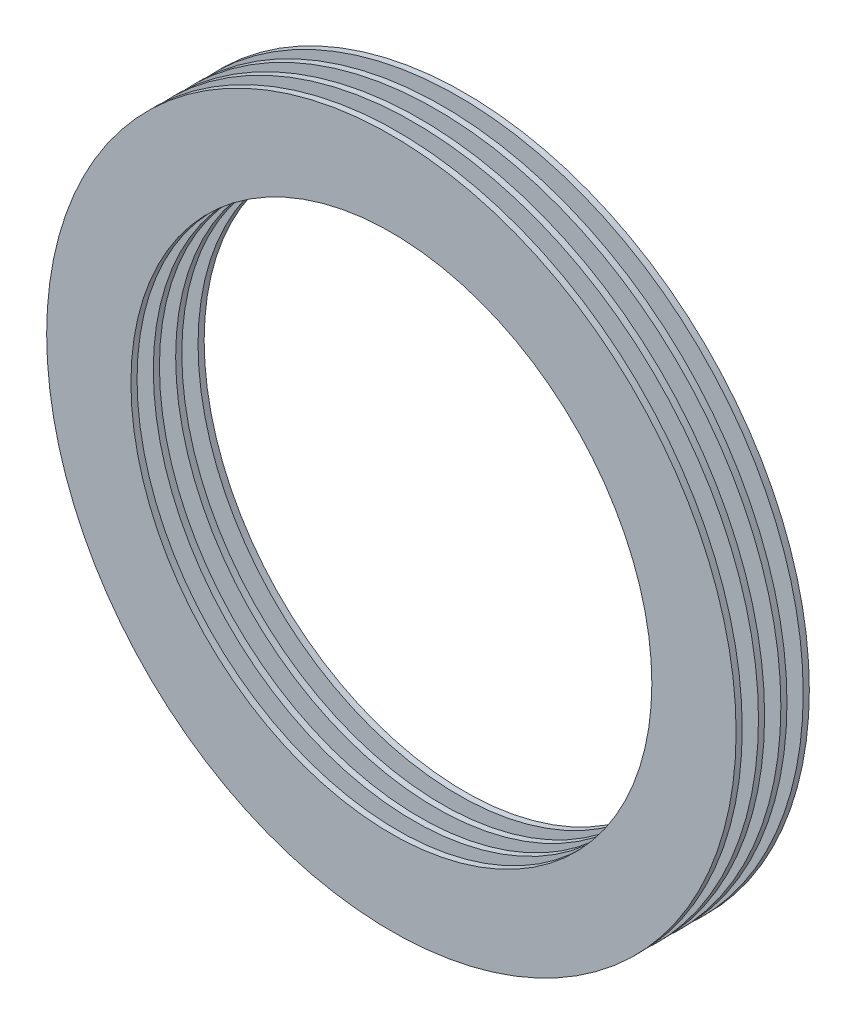
ISO-10303-21;
HEADER;
FILE_DESCRIPTION(('STEP AP214'),'2;1');
FILE_NAME('part.step','',(''),(''),'','','');
FILE_SCHEMA(('AUTOMOTIVE_DESIGN { 1 0 10303 214 1 1 1 1 }'));
ENDSEC;
DATA;
#1=APPLICATION_CONTEXT('core data for automotive mechanical design processes');
#2=APPLICATION_PROTOCOL_DEFINITION('international standard','automotive_design',2000,#1);
#3=PRODUCT_CONTEXT('',#1,'mechanical');
#4=PRODUCT('Part','Part','',(#3));
#5=PRODUCT_RELATED_PRODUCT_CATEGORY('part','',(#4));
#6=PRODUCT_DEFINITION_FORMATION('','',#4);
#7=PRODUCT_DEFINITION_CONTEXT('part definition',#1,'design');
#8=PRODUCT_DEFINITION('design','',#6,#7);
#9=PRODUCT_DEFINITION_SHAPE('','',#8);
#10=(LENGTH_UNIT() NAMED_UNIT(*) SI_UNIT(.MILLI.,.METRE.));
#11=(NAMED_UNIT(*) PLANE_ANGLE_UNIT() SI_UNIT($,.RADIAN.));
#12=(NAMED_UNIT(*) SI_UNIT($,.STERADIAN.) SOLID_ANGLE_UNIT());
#13=UNCERTAINTY_MEASURE_WITH_UNIT(LENGTH_MEASURE(1.E-05),#10,'distance_accuracy_value','');
#14=(GEOMETRIC_REPRESENTATION_CONTEXT(3) GLOBAL_UNCERTAINTY_ASSIGNED_CONTEXT((#13)) GLOBAL_UNIT_ASSIGNED_CONTEXT((#10,
#11,#12)) REPRESENTATION_CONTEXT('',''));
#15=CARTESIAN_POINT('',(0.,0.,0.));
#16=DIRECTION('',(0.,0.,1.));
#17=DIRECTION('',(1.,0.,0.));
#18=AXIS2_PLACEMENT_3D('',#15,#16,#17);
#19=CARTESIAN_POINT('',(0.,0.,3.0353));
#20=DIRECTION('',(0.,0.,-1.));
#21=DIRECTION('',(-1.,0.,0.));
#22=AXIS2_PLACEMENT_3D('',#19,#20,#21);
#23=CYLINDRICAL_SURFACE('',#22,10.795);
#24=CARTESIAN_POINT('',(0.,0.,3.0353));
#25=DIRECTION('',(0.,0.,1.));
#26=DIRECTION('',(1.,0.,0.));
#27=AXIS2_PLACEMENT_3D('',#24,#25,#26);
#28=CIRCLE('',#27,10.795);
#29=CARTESIAN_POINT('',(10.795,0.,3.0353));
#30=VERTEX_POINT('',#29);
#31=EDGE_CURVE('E56',#30,#30,#28,.T.);
#32=ORIENTED_EDGE('',*,*,#31,.T.);
#33=EDGE_LOOP('',(#32));
#34=FACE_BOUND('',#33,.T.);
#35=CARTESIAN_POINT('',(0.,0.,2.7813));
#36=DIRECTION('',(0.,0.,1.));
#37=DIRECTION('',(1.,0.,0.));
#38=AXIS2_PLACEMENT_3D('',#35,#36,#37);
#39=CIRCLE('',#38,10.795);
#40=CARTESIAN_POINT('',(10.795,0.,2.7813));
#41=VERTEX_POINT('',#40);
#42=EDGE_CURVE('E63',#41,#41,#39,.T.);
#43=ORIENTED_EDGE('',*,*,#42,.F.);
#44=EDGE_LOOP('',(#43));
#45=FACE_BOUND('',#44,.T.);
#46=ADVANCED_FACE('F48',(#34,#45),#23,.F.);
#47=CARTESIAN_POINT('',(0.,0.,3.0353));
#48=DIRECTION('',(0.,0.,-1.));
#49=DIRECTION('',(-1.,0.,0.));
#50=AXIS2_PLACEMENT_3D('',#47,#48,#49);
#51=CYLINDRICAL_SURFACE('',#50,14.2875);
#52=CARTESIAN_POINT('',(0.,0.,3.0353));
#53=DIRECTION('',(0.,0.,1.));
#54=DIRECTION('',(1.,0.,0.));
#55=AXIS2_PLACEMENT_3D('',#52,#53,#54);
#56=CIRCLE('',#55,14.2875);
#57=CARTESIAN_POINT('',(14.2875,0.,3.0353));
#58=VERTEX_POINT('',#57);
#59=EDGE_CURVE('E11',#58,#58,#56,.T.);
#60=ORIENTED_EDGE('',*,*,#59,.F.);
#61=EDGE_LOOP('',(#60));
#62=FACE_BOUND('',#61,.T.);
#63=CARTESIAN_POINT('',(0.,0.,2.7813));
#64=DIRECTION('',(0.,0.,1.));
#65=DIRECTION('',(1.,0.,0.));
#66=AXIS2_PLACEMENT_3D('',#63,#64,#65);
#67=CIRCLE('',#66,14.2875);
#68=CARTESIAN_POINT('',(14.2875,0.,2.7813));
#69=VERTEX_POINT('',#68);
#70=EDGE_CURVE('E51',#69,#69,#67,.T.);
#71=ORIENTED_EDGE('',*,*,#70,.T.);
#72=EDGE_LOOP('',(#71));
#73=FACE_BOUND('',#72,.T.);
#74=ADVANCED_FACE('F70',(#62,#73),#51,.T.);
#75=CARTESIAN_POINT('',(0.,0.,3.0353));
#76=DIRECTION('',(0.,0.,1.));
#77=DIRECTION('',(1.,0.,0.));
#78=AXIS2_PLACEMENT_3D('',#75,#76,#77);
#79=PLANE('',#78);
#80=ORIENTED_EDGE('',*,*,#31,.F.);
#81=EDGE_LOOP('',(#80));
#82=FACE_BOUND('',#81,.T.);
#83=ORIENTED_EDGE('',*,*,#59,.T.);
#84=EDGE_LOOP('',(#83));
#85=FACE_BOUND('',#84,.T.);
#86=ADVANCED_FACE('F74',(#82,#85),#79,.T.);
#87=CARTESIAN_POINT('',(0.,0.,2.7813));
#88=DIRECTION('',(0.,0.,1.));
#89=DIRECTION('',(1.,0.,0.));
#90=AXIS2_PLACEMENT_3D('',#87,#88,#89);
#91=PLANE('',#90);
#92=ORIENTED_EDGE('',*,*,#42,.T.);
#93=EDGE_LOOP('',(#92));
#94=FACE_BOUND('',#93,.T.);
#95=ORIENTED_EDGE('',*,*,#70,.F.);
#96=EDGE_LOOP('',(#95));
#97=FACE_BOUND('',#96,.T.);
#98=ADVANCED_FACE('F72',(#94,#97),#91,.F.);
#99=CLOSED_SHELL('',(#46,#74,#86,#98));
#100=MANIFOLD_SOLID_BREP('B2',#99);
#101=CARTESIAN_POINT('',(0.,0.,2.1082));
#102=DIRECTION('',(0.,0.,-1.));
#103=DIRECTION('',(-1.,0.,0.));
#104=AXIS2_PLACEMENT_3D('',#101,#102,#103);
#105=CYLINDRICAL_SURFACE('',#104,10.795);
#106=CARTESIAN_POINT('',(0.,0.,2.1082));
#107=DIRECTION('',(0.,0.,1.));
#108=DIRECTION('',(1.,0.,0.));
#109=AXIS2_PLACEMENT_3D('',#106,#107,#108);
#110=CIRCLE('',#109,10.795);
#111=CARTESIAN_POINT('',(10.795,0.,2.1082));
#112=VERTEX_POINT('',#111);
#113=EDGE_CURVE('E130',#112,#112,#110,.T.);
#114=ORIENTED_EDGE('',*,*,#113,.T.);
#115=EDGE_LOOP('',(#114));
#116=FACE_BOUND('',#115,.T.);
#117=CARTESIAN_POINT('',(0.,0.,1.8542));
#118=DIRECTION('',(0.,0.,1.));
#119=DIRECTION('',(1.,0.,0.));
#120=AXIS2_PLACEMENT_3D('',#117,#118,#119);
#121=CIRCLE('',#120,10.795);
#122=CARTESIAN_POINT('',(10.795,0.,1.8542));
#123=VERTEX_POINT('',#122);
#124=EDGE_CURVE('E137',#123,#123,#121,.T.);
#125=ORIENTED_EDGE('',*,*,#124,.F.);
#126=EDGE_LOOP('',(#125));
#127=FACE_BOUND('',#126,.T.);
#128=ADVANCED_FACE('F122',(#116,#127),#105,.F.);
#129=CARTESIAN_POINT('',(0.,0.,2.1082));
#130=DIRECTION('',(0.,0.,-1.));
#131=DIRECTION('',(-1.,0.,0.));
#132=AXIS2_PLACEMENT_3D('',#129,#130,#131);
#133=CYLINDRICAL_SURFACE('',#132,14.2875);
#134=CARTESIAN_POINT('',(0.,0.,2.1082));
#135=DIRECTION('',(0.,0.,1.));
#136=DIRECTION('',(1.,0.,0.));
#137=AXIS2_PLACEMENT_3D('',#134,#135,#136);
#138=CIRCLE('',#137,14.2875);
#139=CARTESIAN_POINT('',(14.2875,0.,2.1082));
#140=VERTEX_POINT('',#139);
#141=EDGE_CURVE('E47',#140,#140,#138,.T.);
#142=ORIENTED_EDGE('',*,*,#141,.F.);
#143=EDGE_LOOP('',(#142));
#144=FACE_BOUND('',#143,.T.);
#145=CARTESIAN_POINT('',(0.,0.,1.8542));
#146=DIRECTION('',(0.,0.,1.));
#147=DIRECTION('',(1.,0.,0.));
#148=AXIS2_PLACEMENT_3D('',#145,#146,#147);
#149=CIRCLE('',#148,14.2875);
#150=CARTESIAN_POINT('',(14.2875,0.,1.8542));
#151=VERTEX_POINT('',#150);
#152=EDGE_CURVE('E125',#151,#151,#149,.T.);
#153=ORIENTED_EDGE('',*,*,#152,.T.);
#154=EDGE_LOOP('',(#153));
#155=FACE_BOUND('',#154,.T.);
#156=ADVANCED_FACE('F144',(#144,#155),#133,.T.);
#157=CARTESIAN_POINT('',(0.,0.,2.1082));
#158=DIRECTION('',(0.,0.,1.));
#159=DIRECTION('',(1.,0.,0.));
#160=AXIS2_PLACEMENT_3D('',#157,#158,#159);
#161=PLANE('',#160);
#162=ORIENTED_EDGE('',*,*,#113,.F.);
#163=EDGE_LOOP('',(#162));
#164=FACE_BOUND('',#163,.T.);
#165=ORIENTED_EDGE('',*,*,#141,.T.);
#166=EDGE_LOOP('',(#165));
#167=FACE_BOUND('',#166,.T.);
#168=ADVANCED_FACE('F148',(#164,#167),#161,.T.);
#169=CARTESIAN_POINT('',(0.,0.,1.8542));
#170=DIRECTION('',(0.,0.,1.));
#171=DIRECTION('',(1.,0.,0.));
#172=AXIS2_PLACEMENT_3D('',#169,#170,#171);
#173=PLANE('',#172);
#174=ORIENTED_EDGE('',*,*,#124,.T.);
#175=EDGE_LOOP('',(#174));
#176=FACE_BOUND('',#175,.T.);
#177=ORIENTED_EDGE('',*,*,#152,.F.);
#178=EDGE_LOOP('',(#177));
#179=FACE_BOUND('',#178,.T.);
#180=ADVANCED_FACE('F146',(#176,#179),#173,.F.);
#181=CLOSED_SHELL('',(#128,#156,#168,#180));
#182=MANIFOLD_SOLID_BREP('B6',#181);
#183=CARTESIAN_POINT('',(0.,0.,1.1811));
#184=DIRECTION('',(0.,0.,-1.));
#185=DIRECTION('',(-1.,0.,0.));
#186=AXIS2_PLACEMENT_3D('',#183,#184,#185);
#187=CYLINDRICAL_SURFACE('',#186,10.795);
#188=CARTESIAN_POINT('',(0.,0.,1.1811));
#189=DIRECTION('',(0.,0.,1.));
#190=DIRECTION('',(1.,0.,0.));
#191=AXIS2_PLACEMENT_3D('',#188,#189,#190);
#192=CIRCLE('',#191,10.795);
#193=CARTESIAN_POINT('',(10.795,0.,1.1811));
#194=VERTEX_POINT('',#193);
#195=EDGE_CURVE('E203',#194,#194,#192,.T.);
#196=ORIENTED_EDGE('',*,*,#195,.T.);
#197=EDGE_LOOP('',(#196));
#198=FACE_BOUND('',#197,.T.);
#199=CARTESIAN_POINT('',(0.,0.,0.9271));
#200=DIRECTION('',(0.,0.,1.));
#201=DIRECTION('',(1.,0.,0.));
#202=AXIS2_PLACEMENT_3D('',#199,#200,#201);
#203=CIRCLE('',#202,10.795);
#204=CARTESIAN_POINT('',(10.795,0.,0.9271));
#205=VERTEX_POINT('',#204);
#206=EDGE_CURVE('E210',#205,#205,#203,.T.);
#207=ORIENTED_EDGE('',*,*,#206,.F.);
#208=EDGE_LOOP('',(#207));
#209=FACE_BOUND('',#208,.T.);
#210=ADVANCED_FACE('F195',(#198,#209),#187,.F.);
#211=CARTESIAN_POINT('',(0.,0.,1.1811));
#212=DIRECTION('',(0.,0.,-1.));
#213=DIRECTION('',(-1.,0.,0.));
#214=AXIS2_PLACEMENT_3D('',#211,#212,#213);
#215=CYLINDRICAL_SURFACE('',#214,14.2875);
#216=CARTESIAN_POINT('',(0.,0.,1.1811));
#217=DIRECTION('',(0.,0.,1.));
#218=DIRECTION('',(1.,0.,0.));
#219=AXIS2_PLACEMENT_3D('',#216,#217,#218);
#220=CIRCLE('',#219,14.2875);
#221=CARTESIAN_POINT('',(14.2875,0.,1.1811));
#222=VERTEX_POINT('',#221);
#223=EDGE_CURVE('E121',#222,#222,#220,.T.);
#224=ORIENTED_EDGE('',*,*,#223,.F.);
#225=EDGE_LOOP('',(#224));
#226=FACE_BOUND('',#225,.T.);
#227=CARTESIAN_POINT('',(0.,0.,0.9271));
#228=DIRECTION('',(0.,0.,1.));
#229=DIRECTION('',(1.,0.,0.));
#230=AXIS2_PLACEMENT_3D('',#227,#228,#229);
#231=CIRCLE('',#230,14.2875);
#232=CARTESIAN_POINT('',(14.2875,0.,0.9271));
#233=VERTEX_POINT('',#232);
#234=EDGE_CURVE('E198',#233,#233,#231,.T.);
#235=ORIENTED_EDGE('',*,*,#234,.T.);
#236=EDGE_LOOP('',(#235));
#237=FACE_BOUND('',#236,.T.);
#238=ADVANCED_FACE('F219',(#226,#237),#215,.T.);
#239=CARTESIAN_POINT('',(0.,0.,1.1811));
#240=DIRECTION('',(0.,0.,1.));
#241=DIRECTION('',(1.,0.,0.));
#242=AXIS2_PLACEMENT_3D('',#239,#240,#241);
#243=PLANE('',#242);
#244=ORIENTED_EDGE('',*,*,#195,.F.);
#245=EDGE_LOOP('',(#244));
#246=FACE_BOUND('',#245,.T.);
#247=ORIENTED_EDGE('',*,*,#223,.T.);
#248=EDGE_LOOP('',(#247));
#249=FACE_BOUND('',#248,.T.);
#250=ADVANCED_FACE('F223',(#246,#249),#243,.T.);
#251=CARTESIAN_POINT('',(0.,0.,0.9271));
#252=DIRECTION('',(0.,0.,1.));
#253=DIRECTION('',(1.,0.,0.));
#254=AXIS2_PLACEMENT_3D('',#251,#252,#253);
#255=PLANE('',#254);
#256=ORIENTED_EDGE('',*,*,#206,.T.);
#257=EDGE_LOOP('',(#256));
#258=FACE_BOUND('',#257,.T.);
#259=ORIENTED_EDGE('',*,*,#234,.F.);
#260=EDGE_LOOP('',(#259));
#261=FACE_BOUND('',#260,.T.);
#262=ADVANCED_FACE('F221',(#258,#261),#255,.F.);
#263=CLOSED_SHELL('',(#210,#238,#250,#262));
#264=MANIFOLD_SOLID_BREP('B42',#263);
#265=CARTESIAN_POINT('',(0.,0.,0.254));
#266=DIRECTION('',(0.,0.,-1.));
#267=DIRECTION('',(-1.,0.,0.));
#268=AXIS2_PLACEMENT_3D('',#265,#266,#267);
#269=CYLINDRICAL_SURFACE('',#268,10.795);
#270=CARTESIAN_POINT('',(0.,0.,0.254));
#271=DIRECTION('',(0.,0.,1.));
#272=DIRECTION('',(1.,0.,0.));
#273=AXIS2_PLACEMENT_3D('',#270,#271,#272);
#274=CIRCLE('',#273,10.795);
#275=CARTESIAN_POINT('',(10.795,0.,0.254));
#276=VERTEX_POINT('',#275);
#277=EDGE_CURVE('E272',#276,#276,#274,.T.);
#278=ORIENTED_EDGE('',*,*,#277,.T.);
#279=EDGE_LOOP('',(#278));
#280=FACE_BOUND('',#279,.T.);
#281=CARTESIAN_POINT('',(0.,0.,0.));
#282=DIRECTION('',(0.,0.,1.));
#283=DIRECTION('',(1.,0.,0.));
#284=AXIS2_PLACEMENT_3D('',#281,#282,#283);
#285=CIRCLE('',#284,10.795);
#286=CARTESIAN_POINT('',(10.795,0.,0.));
#287=VERTEX_POINT('',#286);
#288=EDGE_CURVE('E279',#287,#287,#285,.T.);
#289=ORIENTED_EDGE('',*,*,#288,.F.);
#290=EDGE_LOOP('',(#289));
#291=FACE_BOUND('',#290,.T.);
#292=ADVANCED_FACE('F264',(#280,#291),#269,.F.);
#293=CARTESIAN_POINT('',(0.,0.,0.254));
#294=DIRECTION('',(0.,0.,-1.));
#295=DIRECTION('',(-1.,0.,0.));
#296=AXIS2_PLACEMENT_3D('',#293,#294,#295);
#297=CYLINDRICAL_SURFACE('',#296,14.2875);
#298=CARTESIAN_POINT('',(0.,0.,0.254));
#299=DIRECTION('',(0.,0.,1.));
#300=DIRECTION('',(1.,0.,0.));
#301=AXIS2_PLACEMENT_3D('',#298,#299,#300);
#302=CIRCLE('',#301,14.2875);
#303=CARTESIAN_POINT('',(14.2875,0.,0.254));
#304=VERTEX_POINT('',#303);
#305=EDGE_CURVE('E194',#304,#304,#302,.T.);
#306=ORIENTED_EDGE('',*,*,#305,.F.);
#307=EDGE_LOOP('',(#306));
#308=FACE_BOUND('',#307,.T.);
#309=CARTESIAN_POINT('',(0.,0.,0.));
#310=DIRECTION('',(0.,0.,1.));
#311=DIRECTION('',(1.,0.,0.));
#312=AXIS2_PLACEMENT_3D('',#309,#310,#311);
#313=CIRCLE('',#312,14.2875);
#314=CARTESIAN_POINT('',(14.2875,0.,0.));
#315=VERTEX_POINT('',#314);
#316=EDGE_CURVE('E267',#315,#315,#313,.T.);
#317=ORIENTED_EDGE('',*,*,#316,.T.);
#318=EDGE_LOOP('',(#317));
#319=FACE_BOUND('',#318,.T.);
#320=ADVANCED_FACE('F286',(#308,#319),#297,.T.);
#321=CARTESIAN_POINT('',(0.,0.,0.254));
#322=DIRECTION('',(0.,0.,1.));
#323=DIRECTION('',(1.,0.,0.));
#324=AXIS2_PLACEMENT_3D('',#321,#322,#323);
#325=PLANE('',#324);
#326=ORIENTED_EDGE('',*,*,#277,.F.);
#327=EDGE_LOOP('',(#326));
#328=FACE_BOUND('',#327,.T.);
#329=ORIENTED_EDGE('',*,*,#305,.T.);
#330=EDGE_LOOP('',(#329));
#331=FACE_BOUND('',#330,.T.);
#332=ADVANCED_FACE('F290',(#328,#331),#325,.T.);
#333=CARTESIAN_POINT('',(0.,0.,0.));
#334=DIRECTION('',(0.,0.,1.));
#335=DIRECTION('',(1.,0.,0.));
#336=AXIS2_PLACEMENT_3D('',#333,#334,#335);
#337=PLANE('',#336);
#338=ORIENTED_EDGE('',*,*,#288,.T.);
#339=EDGE_LOOP('',(#338));
#340=FACE_BOUND('',#339,.T.);
#341=ORIENTED_EDGE('',*,*,#316,.F.);
#342=EDGE_LOOP('',(#341));
#343=FACE_BOUND('',#342,.T.);
#344=ADVANCED_FACE('F288',(#340,#343),#337,.F.);
#345=CLOSED_SHELL('',(#292,#320,#332,#344));
#346=MANIFOLD_SOLID_BREP('B116',#345);
#347=ADVANCED_BREP_SHAPE_REPRESENTATION('',(#18,#100,#182,#264,#346),#14);
#348=SHAPE_DEFINITION_REPRESENTATION(#9,#347);
ENDSEC;
END-ISO-10303-21;
